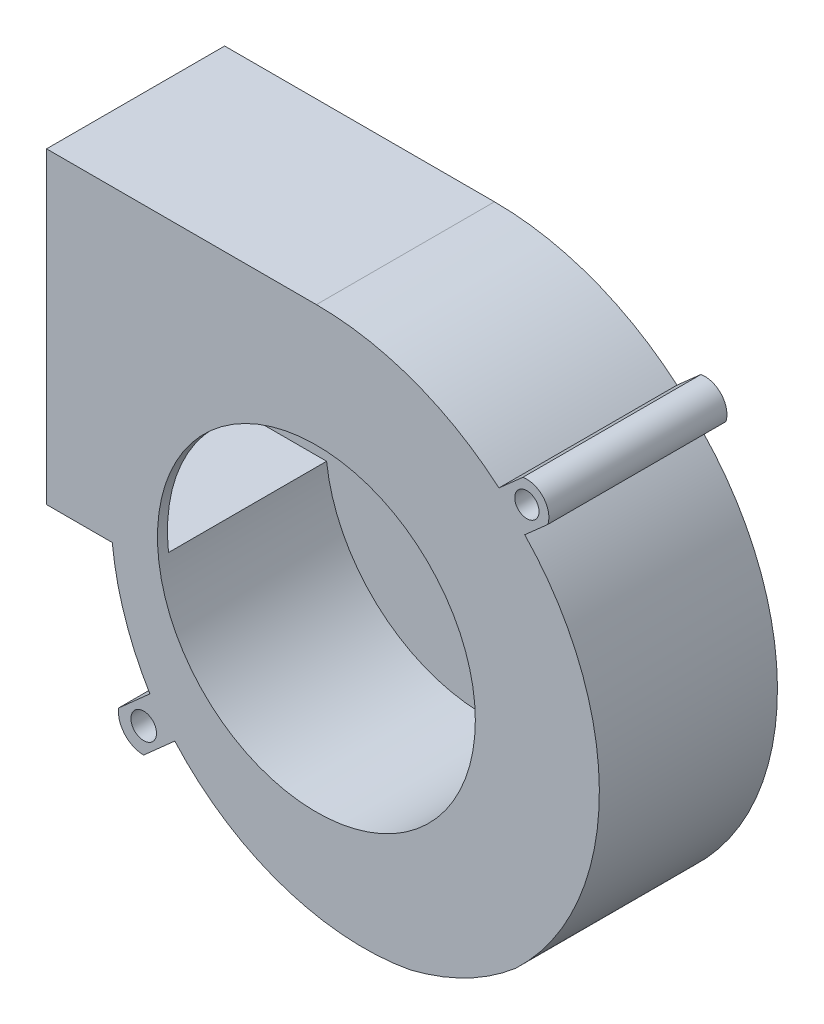
ISO-10303-21;
HEADER;
FILE_DESCRIPTION(('STEP AP214'),'2;1');
FILE_NAME('part.step','',(''),(''),'','','');
FILE_SCHEMA(('AUTOMOTIVE_DESIGN { 1 0 10303 214 1 1 1 1 }'));
ENDSEC;
DATA;
#1=APPLICATION_CONTEXT('core data for automotive mechanical design processes');
#2=APPLICATION_PROTOCOL_DEFINITION('international standard','automotive_design',2000,#1);
#3=PRODUCT_CONTEXT('',#1,'mechanical');
#4=PRODUCT('Part','Part','',(#3));
#5=PRODUCT_RELATED_PRODUCT_CATEGORY('part','',(#4));
#6=PRODUCT_DEFINITION_FORMATION('','',#4);
#7=PRODUCT_DEFINITION_CONTEXT('part definition',#1,'design');
#8=PRODUCT_DEFINITION('design','',#6,#7);
#9=PRODUCT_DEFINITION_SHAPE('','',#8);
#10=(LENGTH_UNIT() NAMED_UNIT(*) SI_UNIT(.MILLI.,.METRE.));
#11=(NAMED_UNIT(*) PLANE_ANGLE_UNIT() SI_UNIT($,.RADIAN.));
#12=(NAMED_UNIT(*) SI_UNIT($,.STERADIAN.) SOLID_ANGLE_UNIT());
#13=UNCERTAINTY_MEASURE_WITH_UNIT(LENGTH_MEASURE(1.E-05),#10,'distance_accuracy_value','');
#14=(GEOMETRIC_REPRESENTATION_CONTEXT(3) GLOBAL_UNCERTAINTY_ASSIGNED_CONTEXT((#13)) GLOBAL_UNIT_ASSIGNED_CONTEXT((#10,
#11,#12)) REPRESENTATION_CONTEXT('',''));
#15=CARTESIAN_POINT('',(0.,0.,0.));
#16=DIRECTION('',(0.,0.,1.));
#17=DIRECTION('',(1.,0.,0.));
#18=AXIS2_PLACEMENT_3D('',#15,#16,#17);
#19=CARTESIAN_POINT('',(-17.490537214231,-60.9256602946654,33.));
#20=DIRECTION('',(0.,0.,-1.));
#21=DIRECTION('',(-1.,0.,0.));
#22=AXIS2_PLACEMENT_3D('',#19,#20,#21);
#23=PLANE('',#22);
#24=CARTESIAN_POINT('',(-17.4905372142311,-60.9256602946654,33.));
#25=DIRECTION('',(0.,0.,1.));
#26=DIRECTION('',(1.,0.,0.));
#27=AXIS2_PLACEMENT_3D('',#24,#25,#26);
#28=CIRCLE('',#27,29.45);
#29=CARTESIAN_POINT('',(11.9594627857689,-60.9256602946654,33.));
#30=VERTEX_POINT('',#29);
#31=EDGE_CURVE('E225',#30,#30,#28,.T.);
#32=ORIENTED_EDGE('',*,*,#31,.F.);
#33=EDGE_LOOP('',(#32));
#34=FACE_BOUND('',#33,.T.);
#35=DIRECTION('',(-1.,0.,0.));
#36=VECTOR('',#35,1.);
#37=CARTESIAN_POINT('',(-67.490537214231,-8.92566029466538,33.));
#38=LINE('',#37,#36);
#39=CARTESIAN_POINT('',(-17.490537214231,-8.92566029466539,33.));
#40=VERTEX_POINT('',#39);
#41=CARTESIAN_POINT('',(-67.490537214231,-8.92566029466538,33.));
#42=VERTEX_POINT('',#41);
#43=EDGE_CURVE('E250',#40,#42,#38,.T.);
#44=ORIENTED_EDGE('',*,*,#43,.T.);
#45=DIRECTION('',(0.,-1.,0.));
#46=VECTOR('',#45,1.);
#47=CARTESIAN_POINT('',(-67.490537214231,-8.92566029466538,33.));
#48=LINE('',#47,#46);
#49=CARTESIAN_POINT('',(-67.490537214231,-66.0181647608201,33.));
#50=VERTEX_POINT('',#49);
#51=EDGE_CURVE('E254',#42,#50,#48,.T.);
#52=ORIENTED_EDGE('',*,*,#51,.T.);
#53=DIRECTION('',(1.,0.,0.));
#54=VECTOR('',#53,1.);
#55=CARTESIAN_POINT('',(-67.490537214231,-66.0181647608201,33.));
#56=LINE('',#55,#54);
#57=CARTESIAN_POINT('',(-55.3154359771535,-66.0181647608201,33.));
#58=VERTEX_POINT('',#57);
#59=EDGE_CURVE('E258',#50,#58,#56,.T.);
#60=ORIENTED_EDGE('',*,*,#59,.T.);
#61=CARTESIAN_POINT('',(-5.58928040063661,-60.9256602946654,33.));
#62=DIRECTION('',(0.,0.,1.));
#63=DIRECTION('',(-1.,0.,0.));
#64=AXIS2_PLACEMENT_3D('',#61,#62,#63);
#65=CIRCLE('',#64,49.9862396080939);
#66=CARTESIAN_POINT('',(-48.34494044341,-86.8211750504018,33.));
#67=VERTEX_POINT('',#66);
#68=EDGE_CURVE('E261',#58,#67,#65,.T.);
#69=ORIENTED_EDGE('',*,*,#68,.T.);
#70=DIRECTION('',(-0.747052889529198,-0.66476460513935,0.));
#71=VECTOR('',#70,1.);
#72=CARTESIAN_POINT('',(-54.153009968696,-91.9894825406946,33.));
#73=LINE('',#72,#71);
#74=CARTESIAN_POINT('',(-54.153009968696,-91.9894825406946,33.));
#75=VERTEX_POINT('',#74);
#76=EDGE_CURVE('E264',#67,#75,#73,.T.);
#77=ORIENTED_EDGE('',*,*,#76,.T.);
#78=CARTESIAN_POINT('',(-49.490537214231,-92.5256602946654,33.));
#79=DIRECTION('',(0.,0.,1.));
#80=DIRECTION('',(1.,0.,0.));
#81=AXIS2_PLACEMENT_3D('',#78,#79,#80);
#82=CIRCLE('',#81,4.69320133490787);
#83=CARTESIAN_POINT('',(-49.4996577327205,-97.218852767399,33.));
#84=VERTEX_POINT('',#83);
#85=EDGE_CURVE('E267',#75,#84,#82,.T.);
#86=ORIENTED_EDGE('',*,*,#85,.T.);
#87=DIRECTION('',(0.747052889529198,0.664764605139351,0.));
#88=VECTOR('',#87,1.);
#89=CARTESIAN_POINT('',(-49.4996577327205,-97.218852767399,33.));
#90=LINE('',#89,#88);
#91=CARTESIAN_POINT('',(-43.7324722005959,-92.0869258760589,33.));
#92=VERTEX_POINT('',#91);
#93=EDGE_CURVE('E270',#84,#92,#90,.T.);
#94=ORIENTED_EDGE('',*,*,#93,.T.);
#95=CARTESIAN_POINT('',(-8.72822714979214,-60.9256602946654,33.));
#96=DIRECTION('',(0.,0.,1.));
#97=DIRECTION('',(-1.,0.,0.));
#98=AXIS2_PLACEMENT_3D('',#95,#96,#97);
#99=CIRCLE('',#98,46.8649297898851);
#100=CARTESIAN_POINT('',(-0.10362401501067,-106.990157089685,33.));
#101=VERTEX_POINT('',#100);
#102=EDGE_CURVE('E273',#92,#101,#99,.T.);
#103=ORIENTED_EDGE('',*,*,#102,.T.);
#104=CARTESIAN_POINT('',(-11.388693724512,-60.9256602946654,33.));
#105=DIRECTION('',(0.,0.,1.));
#106=DIRECTION('',(-1.,0.,0.));
#107=AXIS2_PLACEMENT_3D('',#104,#105,#106);
#108=CIRCLE('',#107,47.4266872480746);
#109=CARTESIAN_POINT('',(19.4150708220178,-96.9869796422521,33.));
#110=VERTEX_POINT('',#109);
#111=EDGE_CURVE('E276',#101,#110,#108,.T.);
#112=ORIENTED_EDGE('',*,*,#111,.T.);
#113=CARTESIAN_POINT('',(-14.6994192154625,-60.9256602946654,33.));
#114=DIRECTION('',(0.,0.,1.));
#115=DIRECTION('',(-1.,0.,0.));
#116=AXIS2_PLACEMENT_3D('',#113,#114,#115);
#117=CIRCLE('',#116,49.6408821799731);
#118=CARTESIAN_POINT('',(21.1140825761364,-26.5511017807133,33.));
#119=VERTEX_POINT('',#118);
#120=EDGE_CURVE('E279',#110,#119,#117,.T.);
#121=ORIENTED_EDGE('',*,*,#120,.T.);
#122=DIRECTION('',(0.748618319413504,0.663001215563366,0.));
#123=VECTOR('',#122,1.);
#124=CARTESIAN_POINT('',(25.3924975337408,-22.761995577971,33.));
#125=LINE('',#124,#123);
#126=CARTESIAN_POINT('',(25.3924975337408,-22.761995577971,33.));
#127=VERTEX_POINT('',#126);
#128=EDGE_CURVE('E282',#119,#127,#125,.T.);
#129=ORIENTED_EDGE('',*,*,#128,.T.);
#130=CARTESIAN_POINT('',(21.509462785769,-21.5256602946654,33.));
#131=DIRECTION('',(0.,0.,1.));
#132=DIRECTION('',(-1.,0.,0.));
#133=AXIS2_PLACEMENT_3D('',#130,#131,#132);
#134=CIRCLE('',#133,4.07510537123927);
#135=CARTESIAN_POINT('',(20.7514890247972,-17.5216673420765,33.));
#136=VERTEX_POINT('',#135);
#137=EDGE_CURVE('E285',#127,#136,#134,.T.);
#138=ORIENTED_EDGE('',*,*,#137,.T.);
#139=DIRECTION('',(-0.748618319413503,-0.663001215563367,0.));
#140=VECTOR('',#139,1.);
#141=CARTESIAN_POINT('',(20.7514890247972,-17.5216673420765,33.));
#142=LINE('',#141,#140);
#143=CARTESIAN_POINT('',(16.3362156459673,-21.4319799022904,33.));
#144=VERTEX_POINT('',#143);
#145=EDGE_CURVE('E288',#136,#144,#142,.T.);
#146=ORIENTED_EDGE('',*,*,#145,.T.);
#147=CARTESIAN_POINT('',(-17.490537214231,-60.9256602946654,33.));
#148=DIRECTION('',(0.,0.,1.));
#149=DIRECTION('',(-1.,0.,0.));
#150=AXIS2_PLACEMENT_3D('',#147,#148,#149);
#151=CIRCLE('',#150,52.);
#152=EDGE_CURVE('E291',#144,#40,#151,.T.);
#153=ORIENTED_EDGE('',*,*,#152,.T.);
#154=EDGE_LOOP('',(#44,#52,#60,#69,#77,#86,#94,#103,#112,#121,#129,#138,#146,#153));
#155=FACE_BOUND('',#154,.T.);
#156=CARTESIAN_POINT('',(21.509462785769,-21.5256602946654,33.));
#157=DIRECTION('',(0.,0.,1.));
#158=DIRECTION('',(1.,0.,0.));
#159=AXIS2_PLACEMENT_3D('',#156,#157,#158);
#160=CIRCLE('',#159,2.25);
#161=CARTESIAN_POINT('',(23.759462785769,-21.5256602946654,33.));
#162=VERTEX_POINT('',#161);
#163=EDGE_CURVE('E242',#162,#162,#160,.T.);
#164=ORIENTED_EDGE('',*,*,#163,.F.);
#165=EDGE_LOOP('',(#164));
#166=FACE_BOUND('',#165,.T.);
#167=CARTESIAN_POINT('',(-49.490537214231,-92.5256602946654,33.));
#168=DIRECTION('',(0.,0.,1.));
#169=DIRECTION('',(1.,0.,0.));
#170=AXIS2_PLACEMENT_3D('',#167,#168,#169);
#171=CIRCLE('',#170,2.37208847710016);
#172=CARTESIAN_POINT('',(-47.1184487371309,-92.5256602946654,33.));
#173=VERTEX_POINT('',#172);
#174=EDGE_CURVE('E234',#173,#173,#171,.T.);
#175=ORIENTED_EDGE('',*,*,#174,.F.);
#176=EDGE_LOOP('',(#175));
#177=FACE_BOUND('',#176,.T.);
#178=ADVANCED_FACE('F43',(#34,#155,#166,#177),#23,.F.);
#179=CARTESIAN_POINT('',(-17.490537214231,-60.9256602946654,0.));
#180=DIRECTION('',(0.,0.,-1.));
#181=DIRECTION('',(-1.,0.,0.));
#182=AXIS2_PLACEMENT_3D('',#179,#180,#181);
#183=PLANE('',#182);
#184=CARTESIAN_POINT('',(21.509462785769,-21.5256602946654,0.));
#185=DIRECTION('',(0.,0.,1.));
#186=DIRECTION('',(1.,0.,0.));
#187=AXIS2_PLACEMENT_3D('',#184,#185,#186);
#188=CIRCLE('',#187,2.25);
#189=CARTESIAN_POINT('',(23.759462785769,-21.5256602946654,0.));
#190=VERTEX_POINT('',#189);
#191=EDGE_CURVE('E238',#190,#190,#188,.T.);
#192=ORIENTED_EDGE('',*,*,#191,.T.);
#193=EDGE_LOOP('',(#192));
#194=FACE_BOUND('',#193,.T.);
#195=DIRECTION('',(-1.,0.,0.));
#196=VECTOR('',#195,1.);
#197=CARTESIAN_POINT('',(-67.490537214231,-8.92566029466538,0.));
#198=LINE('',#197,#196);
#199=CARTESIAN_POINT('',(-17.490537214231,-8.92566029466539,0.));
#200=VERTEX_POINT('',#199);
#201=CARTESIAN_POINT('',(-67.490537214231,-8.92566029466538,0.));
#202=VERTEX_POINT('',#201);
#203=EDGE_CURVE('E246',#200,#202,#198,.T.);
#204=ORIENTED_EDGE('',*,*,#203,.F.);
#205=CARTESIAN_POINT('',(-17.490537214231,-60.9256602946654,0.));
#206=DIRECTION('',(0.,0.,1.));
#207=DIRECTION('',(-1.,0.,0.));
#208=AXIS2_PLACEMENT_3D('',#205,#206,#207);
#209=CIRCLE('',#208,52.);
#210=CARTESIAN_POINT('',(16.3362156459673,-21.4319799022904,0.));
#211=VERTEX_POINT('',#210);
#212=EDGE_CURVE('E255',#211,#200,#209,.T.);
#213=ORIENTED_EDGE('',*,*,#212,.F.);
#214=DIRECTION('',(-0.748618319413503,-0.663001215563367,0.));
#215=VECTOR('',#214,1.);
#216=CARTESIAN_POINT('',(20.7514890247972,-17.5216673420765,0.));
#217=LINE('',#216,#215);
#218=CARTESIAN_POINT('',(20.7514890247972,-17.5216673420765,0.));
#219=VERTEX_POINT('',#218);
#220=EDGE_CURVE('E331',#219,#211,#217,.T.);
#221=ORIENTED_EDGE('',*,*,#220,.F.);
#222=CARTESIAN_POINT('',(21.509462785769,-21.5256602946654,0.));
#223=DIRECTION('',(0.,0.,1.));
#224=DIRECTION('',(-1.,0.,0.));
#225=AXIS2_PLACEMENT_3D('',#222,#223,#224);
#226=CIRCLE('',#225,4.07510537123927);
#227=CARTESIAN_POINT('',(25.3924975337408,-22.761995577971,0.));
#228=VERTEX_POINT('',#227);
#229=EDGE_CURVE('E328',#228,#219,#226,.T.);
#230=ORIENTED_EDGE('',*,*,#229,.F.);
#231=DIRECTION('',(0.748618319413504,0.663001215563366,0.));
#232=VECTOR('',#231,1.);
#233=CARTESIAN_POINT('',(25.3924975337408,-22.761995577971,0.));
#234=LINE('',#233,#232);
#235=CARTESIAN_POINT('',(21.1140825761364,-26.5511017807133,0.));
#236=VERTEX_POINT('',#235);
#237=EDGE_CURVE('E325',#236,#228,#234,.T.);
#238=ORIENTED_EDGE('',*,*,#237,.F.);
#239=CARTESIAN_POINT('',(-14.6994192154625,-60.9256602946654,0.));
#240=DIRECTION('',(0.,0.,1.));
#241=DIRECTION('',(-1.,0.,0.));
#242=AXIS2_PLACEMENT_3D('',#239,#240,#241);
#243=CIRCLE('',#242,49.6408821799731);
#244=CARTESIAN_POINT('',(19.4150708220178,-96.9869796422521,0.));
#245=VERTEX_POINT('',#244);
#246=EDGE_CURVE('E322',#245,#236,#243,.T.);
#247=ORIENTED_EDGE('',*,*,#246,.F.);
#248=CARTESIAN_POINT('',(-11.388693724512,-60.9256602946654,0.));
#249=DIRECTION('',(0.,0.,1.));
#250=DIRECTION('',(-1.,0.,0.));
#251=AXIS2_PLACEMENT_3D('',#248,#249,#250);
#252=CIRCLE('',#251,47.4266872480746);
#253=CARTESIAN_POINT('',(-0.10362401501067,-106.990157089685,0.));
#254=VERTEX_POINT('',#253);
#255=EDGE_CURVE('E319',#254,#245,#252,.T.);
#256=ORIENTED_EDGE('',*,*,#255,.F.);
#257=CARTESIAN_POINT('',(-8.72822714979214,-60.9256602946654,0.));
#258=DIRECTION('',(0.,0.,1.));
#259=DIRECTION('',(-1.,0.,0.));
#260=AXIS2_PLACEMENT_3D('',#257,#258,#259);
#261=CIRCLE('',#260,46.8649297898851);
#262=CARTESIAN_POINT('',(-43.7324722005959,-92.0869258760589,0.));
#263=VERTEX_POINT('',#262);
#264=EDGE_CURVE('E316',#263,#254,#261,.T.);
#265=ORIENTED_EDGE('',*,*,#264,.F.);
#266=DIRECTION('',(0.747052889529198,0.664764605139351,0.));
#267=VECTOR('',#266,1.);
#268=CARTESIAN_POINT('',(-49.4996577327205,-97.218852767399,0.));
#269=LINE('',#268,#267);
#270=CARTESIAN_POINT('',(-49.4996577327205,-97.218852767399,0.));
#271=VERTEX_POINT('',#270);
#272=EDGE_CURVE('E313',#271,#263,#269,.T.);
#273=ORIENTED_EDGE('',*,*,#272,.F.);
#274=CARTESIAN_POINT('',(-49.490537214231,-92.5256602946654,0.));
#275=DIRECTION('',(0.,0.,1.));
#276=DIRECTION('',(1.,0.,0.));
#277=AXIS2_PLACEMENT_3D('',#274,#275,#276);
#278=CIRCLE('',#277,4.69320133490787);
#279=CARTESIAN_POINT('',(-54.153009968696,-91.9894825406946,0.));
#280=VERTEX_POINT('',#279);
#281=EDGE_CURVE('E310',#280,#271,#278,.T.);
#282=ORIENTED_EDGE('',*,*,#281,.F.);
#283=DIRECTION('',(-0.747052889529198,-0.66476460513935,0.));
#284=VECTOR('',#283,1.);
#285=CARTESIAN_POINT('',(-54.153009968696,-91.9894825406946,0.));
#286=LINE('',#285,#284);
#287=CARTESIAN_POINT('',(-48.34494044341,-86.8211750504018,0.));
#288=VERTEX_POINT('',#287);
#289=EDGE_CURVE('E307',#288,#280,#286,.T.);
#290=ORIENTED_EDGE('',*,*,#289,.F.);
#291=CARTESIAN_POINT('',(-5.58928040063661,-60.9256602946654,0.));
#292=DIRECTION('',(0.,0.,1.));
#293=DIRECTION('',(-1.,0.,0.));
#294=AXIS2_PLACEMENT_3D('',#291,#292,#293);
#295=CIRCLE('',#294,49.9862396080939);
#296=CARTESIAN_POINT('',(-55.3154359771535,-66.0181647608201,0.));
#297=VERTEX_POINT('',#296);
#298=EDGE_CURVE('E304',#297,#288,#295,.T.);
#299=ORIENTED_EDGE('',*,*,#298,.F.);
#300=DIRECTION('',(1.,0.,0.));
#301=VECTOR('',#300,1.);
#302=CARTESIAN_POINT('',(-67.490537214231,-66.0181647608201,0.));
#303=LINE('',#302,#301);
#304=CARTESIAN_POINT('',(-67.490537214231,-66.0181647608201,0.));
#305=VERTEX_POINT('',#304);
#306=EDGE_CURVE('E301',#305,#297,#303,.T.);
#307=ORIENTED_EDGE('',*,*,#306,.F.);
#308=DIRECTION('',(0.,-1.,0.));
#309=VECTOR('',#308,1.);
#310=CARTESIAN_POINT('',(-67.490537214231,-8.92566029466538,0.));
#311=LINE('',#310,#309);
#312=EDGE_CURVE('E298',#202,#305,#311,.T.);
#313=ORIENTED_EDGE('',*,*,#312,.F.);
#314=EDGE_LOOP('',(#204,#213,#221,#230,#238,#247,#256,#265,#273,#282,#290,#299,#307,#313));
#315=FACE_BOUND('',#314,.T.);
#316=CARTESIAN_POINT('',(-49.490537214231,-92.5256602946654,0.));
#317=DIRECTION('',(0.,0.,1.));
#318=DIRECTION('',(1.,0.,0.));
#319=AXIS2_PLACEMENT_3D('',#316,#317,#318);
#320=CIRCLE('',#319,2.37208847710016);
#321=CARTESIAN_POINT('',(-47.1184487371309,-92.5256602946654,0.));
#322=VERTEX_POINT('',#321);
#323=EDGE_CURVE('E230',#322,#322,#320,.T.);
#324=ORIENTED_EDGE('',*,*,#323,.T.);
#325=EDGE_LOOP('',(#324));
#326=FACE_BOUND('',#325,.T.);
#327=ADVANCED_FACE('F398',(#194,#315,#326),#183,.T.);
#328=CARTESIAN_POINT('',(-67.490537214231,-8.92566029466538,33.));
#329=DIRECTION('',(0.,-1.,0.));
#330=DIRECTION('',(0.,0.,-1.));
#331=AXIS2_PLACEMENT_3D('',#328,#329,#330);
#332=PLANE('',#331);
#333=ORIENTED_EDGE('',*,*,#203,.T.);
#334=DIRECTION('',(0.,0.,-1.));
#335=VECTOR('',#334,1.);
#336=CARTESIAN_POINT('',(-67.490537214231,-8.92566029466538,33.));
#337=LINE('',#336,#335);
#338=EDGE_CURVE('E52',#42,#202,#337,.T.);
#339=ORIENTED_EDGE('',*,*,#338,.F.);
#340=ORIENTED_EDGE('',*,*,#43,.F.);
#341=DIRECTION('',(0.,0.,-1.));
#342=VECTOR('',#341,1.);
#343=CARTESIAN_POINT('',(-17.490537214231,-8.92566029466539,33.));
#344=LINE('',#343,#342);
#345=EDGE_CURVE('E294',#40,#200,#344,.T.);
#346=ORIENTED_EDGE('',*,*,#345,.T.);
#347=EDGE_LOOP('',(#333,#339,#340,#346));
#348=FACE_BOUND('',#347,.T.);
#349=ADVANCED_FACE('F45',(#348),#332,.F.);
#350=CARTESIAN_POINT('',(-67.490537214231,-8.92566029466538,33.));
#351=DIRECTION('',(1.,0.,0.));
#352=DIRECTION('',(0.,0.,-1.));
#353=AXIS2_PLACEMENT_3D('',#350,#351,#352);
#354=PLANE('',#353);
#355=DIRECTION('',(0.,0.,1.));
#356=VECTOR('',#355,1.);
#357=CARTESIAN_POINT('',(-67.490537214231,-64.2681647608201,31.15));
#358=LINE('',#357,#356);
#359=CARTESIAN_POINT('',(-67.490537214231,-64.2681647608201,1.85));
#360=VERTEX_POINT('',#359);
#361=CARTESIAN_POINT('',(-67.490537214231,-64.2681647608201,31.15));
#362=VERTEX_POINT('',#361);
#363=EDGE_CURVE('E206',#360,#362,#358,.T.);
#364=ORIENTED_EDGE('',*,*,#363,.F.);
#365=DIRECTION('',(0.,-1.,0.));
#366=VECTOR('',#365,1.);
#367=CARTESIAN_POINT('',(-67.490537214231,-64.2681647608201,1.85));
#368=LINE('',#367,#366);
#369=CARTESIAN_POINT('',(-67.490537214231,-10.7756602946654,1.85));
#370=VERTEX_POINT('',#369);
#371=EDGE_CURVE('E59',#370,#360,#368,.T.);
#372=ORIENTED_EDGE('',*,*,#371,.F.);
#373=DIRECTION('',(0.,0.,-1.));
#374=VECTOR('',#373,1.);
#375=CARTESIAN_POINT('',(-67.490537214231,-10.7756602946654,1.85));
#376=LINE('',#375,#374);
#377=CARTESIAN_POINT('',(-67.490537214231,-10.7756602946654,31.15));
#378=VERTEX_POINT('',#377);
#379=EDGE_CURVE('E212',#378,#370,#376,.T.);
#380=ORIENTED_EDGE('',*,*,#379,.F.);
#381=DIRECTION('',(0.,1.,0.));
#382=VECTOR('',#381,1.);
#383=CARTESIAN_POINT('',(-67.490537214231,-10.7756602946654,31.15));
#384=LINE('',#383,#382);
#385=EDGE_CURVE('E188',#362,#378,#384,.T.);
#386=ORIENTED_EDGE('',*,*,#385,.F.);
#387=EDGE_LOOP('',(#364,#372,#380,#386));
#388=FACE_BOUND('',#387,.T.);
#389=ORIENTED_EDGE('',*,*,#312,.T.);
#390=DIRECTION('',(0.,0.,-1.));
#391=VECTOR('',#390,1.);
#392=CARTESIAN_POINT('',(-67.490537214231,-66.0181647608201,33.));
#393=LINE('',#392,#391);
#394=EDGE_CURVE('E383',#50,#305,#393,.T.);
#395=ORIENTED_EDGE('',*,*,#394,.F.);
#396=ORIENTED_EDGE('',*,*,#51,.F.);
#397=ORIENTED_EDGE('',*,*,#338,.T.);
#398=EDGE_LOOP('',(#389,#395,#396,#397));
#399=FACE_BOUND('',#398,.T.);
#400=ADVANCED_FACE('F390',(#388,#399),#354,.F.);
#401=CARTESIAN_POINT('',(-67.490537214231,-66.0181647608201,33.));
#402=DIRECTION('',(0.,1.,0.));
#403=DIRECTION('',(0.,0.,1.));
#404=AXIS2_PLACEMENT_3D('',#401,#402,#403);
#405=PLANE('',#404);
#406=ORIENTED_EDGE('',*,*,#306,.T.);
#407=DIRECTION('',(0.,0.,-1.));
#408=VECTOR('',#407,1.);
#409=CARTESIAN_POINT('',(-55.3154359771535,-66.0181647608201,33.));
#410=LINE('',#409,#408);
#411=EDGE_CURVE('E379',#58,#297,#410,.T.);
#412=ORIENTED_EDGE('',*,*,#411,.F.);
#413=ORIENTED_EDGE('',*,*,#59,.F.);
#414=ORIENTED_EDGE('',*,*,#394,.T.);
#415=EDGE_LOOP('',(#406,#412,#413,#414));
#416=FACE_BOUND('',#415,.T.);
#417=ADVANCED_FACE('F406',(#416),#405,.F.);
#418=CARTESIAN_POINT('',(-5.58928040063661,-60.9256602946654,33.));
#419=DIRECTION('',(0.,0.,-1.));
#420=DIRECTION('',(-1.,0.,0.));
#421=AXIS2_PLACEMENT_3D('',#418,#419,#420);
#422=CYLINDRICAL_SURFACE('',#421,49.9862396080939);
#423=ORIENTED_EDGE('',*,*,#298,.T.);
#424=DIRECTION('',(0.,0.,-1.));
#425=VECTOR('',#424,1.);
#426=CARTESIAN_POINT('',(-48.34494044341,-86.8211750504018,33.));
#427=LINE('',#426,#425);
#428=EDGE_CURVE('E375',#67,#288,#427,.T.);
#429=ORIENTED_EDGE('',*,*,#428,.F.);
#430=ORIENTED_EDGE('',*,*,#68,.F.);
#431=ORIENTED_EDGE('',*,*,#411,.T.);
#432=EDGE_LOOP('',(#423,#429,#430,#431));
#433=FACE_BOUND('',#432,.T.);
#434=ADVANCED_FACE('F410',(#433),#422,.T.);
#435=CARTESIAN_POINT('',(-54.153009968696,-91.9894825406946,33.));
#436=DIRECTION('',(0.66476460513935,-0.747052889529198,0.));
#437=DIRECTION('',(0.747052889529198,0.66476460513935,0.));
#438=AXIS2_PLACEMENT_3D('',#435,#436,#437);
#439=PLANE('',#438);
#440=ORIENTED_EDGE('',*,*,#289,.T.);
#441=DIRECTION('',(0.,0.,-1.));
#442=VECTOR('',#441,1.);
#443=CARTESIAN_POINT('',(-54.153009968696,-91.9894825406946,33.));
#444=LINE('',#443,#442);
#445=EDGE_CURVE('E371',#75,#280,#444,.T.);
#446=ORIENTED_EDGE('',*,*,#445,.F.);
#447=ORIENTED_EDGE('',*,*,#76,.F.);
#448=ORIENTED_EDGE('',*,*,#428,.T.);
#449=EDGE_LOOP('',(#440,#446,#447,#448));
#450=FACE_BOUND('',#449,.T.);
#451=ADVANCED_FACE('F459',(#450),#439,.F.);
#452=CARTESIAN_POINT('',(-49.490537214231,-92.5256602946654,33.));
#453=DIRECTION('',(0.,0.,-1.));
#454=DIRECTION('',(-1.,0.,0.));
#455=AXIS2_PLACEMENT_3D('',#452,#453,#454);
#456=CYLINDRICAL_SURFACE('',#455,4.69320133490787);
#457=ORIENTED_EDGE('',*,*,#281,.T.);
#458=DIRECTION('',(0.,0.,-1.));
#459=VECTOR('',#458,1.);
#460=CARTESIAN_POINT('',(-49.4996577327205,-97.218852767399,33.));
#461=LINE('',#460,#459);
#462=EDGE_CURVE('E367',#84,#271,#461,.T.);
#463=ORIENTED_EDGE('',*,*,#462,.F.);
#464=ORIENTED_EDGE('',*,*,#85,.F.);
#465=ORIENTED_EDGE('',*,*,#445,.T.);
#466=EDGE_LOOP('',(#457,#463,#464,#465));
#467=FACE_BOUND('',#466,.T.);
#468=ADVANCED_FACE('F456',(#467),#456,.T.);
#469=CARTESIAN_POINT('',(-49.4996577327205,-97.218852767399,33.));
#470=DIRECTION('',(-0.66476460513935,0.747052889529197,0.));
#471=DIRECTION('',(-0.747052889529197,-0.664764605139351,0.));
#472=AXIS2_PLACEMENT_3D('',#469,#470,#471);
#473=PLANE('',#472);
#474=ORIENTED_EDGE('',*,*,#272,.T.);
#475=DIRECTION('',(0.,0.,-1.));
#476=VECTOR('',#475,1.);
#477=CARTESIAN_POINT('',(-43.7324722005959,-92.0869258760589,33.));
#478=LINE('',#477,#476);
#479=EDGE_CURVE('E363',#92,#263,#478,.T.);
#480=ORIENTED_EDGE('',*,*,#479,.F.);
#481=ORIENTED_EDGE('',*,*,#93,.F.);
#482=ORIENTED_EDGE('',*,*,#462,.T.);
#483=EDGE_LOOP('',(#474,#480,#481,#482));
#484=FACE_BOUND('',#483,.T.);
#485=ADVANCED_FACE('F452',(#484),#473,.F.);
#486=CARTESIAN_POINT('',(-8.72822714979214,-60.9256602946654,33.));
#487=DIRECTION('',(0.,0.,-1.));
#488=DIRECTION('',(-1.,0.,0.));
#489=AXIS2_PLACEMENT_3D('',#486,#487,#488);
#490=CYLINDRICAL_SURFACE('',#489,46.8649297898851);
#491=ORIENTED_EDGE('',*,*,#264,.T.);
#492=DIRECTION('',(0.,0.,-1.));
#493=VECTOR('',#492,1.);
#494=CARTESIAN_POINT('',(-0.10362401501067,-106.990157089685,33.));
#495=LINE('',#494,#493);
#496=EDGE_CURVE('E359',#101,#254,#495,.T.);
#497=ORIENTED_EDGE('',*,*,#496,.F.);
#498=ORIENTED_EDGE('',*,*,#102,.F.);
#499=ORIENTED_EDGE('',*,*,#479,.T.);
#500=EDGE_LOOP('',(#491,#497,#498,#499));
#501=FACE_BOUND('',#500,.T.);
#502=ADVANCED_FACE('F448',(#501),#490,.T.);
#503=CARTESIAN_POINT('',(-11.388693724512,-60.9256602946654,33.));
#504=DIRECTION('',(0.,0.,-1.));
#505=DIRECTION('',(-1.,0.,0.));
#506=AXIS2_PLACEMENT_3D('',#503,#504,#505);
#507=CYLINDRICAL_SURFACE('',#506,47.4266872480746);
#508=ORIENTED_EDGE('',*,*,#255,.T.);
#509=DIRECTION('',(0.,0.,-1.));
#510=VECTOR('',#509,1.);
#511=CARTESIAN_POINT('',(19.4150708220178,-96.9869796422521,33.));
#512=LINE('',#511,#510);
#513=EDGE_CURVE('E355',#110,#245,#512,.T.);
#514=ORIENTED_EDGE('',*,*,#513,.F.);
#515=ORIENTED_EDGE('',*,*,#111,.F.);
#516=ORIENTED_EDGE('',*,*,#496,.T.);
#517=EDGE_LOOP('',(#508,#514,#515,#516));
#518=FACE_BOUND('',#517,.T.);
#519=ADVANCED_FACE('F443',(#518),#507,.T.);
#520=CARTESIAN_POINT('',(-14.6994192154625,-60.9256602946654,33.));
#521=DIRECTION('',(0.,0.,-1.));
#522=DIRECTION('',(-1.,0.,0.));
#523=AXIS2_PLACEMENT_3D('',#520,#521,#522);
#524=CYLINDRICAL_SURFACE('',#523,49.6408821799731);
#525=ORIENTED_EDGE('',*,*,#246,.T.);
#526=DIRECTION('',(0.,0.,-1.));
#527=VECTOR('',#526,1.);
#528=CARTESIAN_POINT('',(21.1140825761364,-26.5511017807133,33.));
#529=LINE('',#528,#527);
#530=EDGE_CURVE('E351',#119,#236,#529,.T.);
#531=ORIENTED_EDGE('',*,*,#530,.F.);
#532=ORIENTED_EDGE('',*,*,#120,.F.);
#533=ORIENTED_EDGE('',*,*,#513,.T.);
#534=EDGE_LOOP('',(#525,#531,#532,#533));
#535=FACE_BOUND('',#534,.T.);
#536=ADVANCED_FACE('F437',(#535),#524,.T.);
#537=CARTESIAN_POINT('',(25.3924975337408,-22.761995577971,33.));
#538=DIRECTION('',(-0.663001215563366,0.748618319413504,0.));
#539=DIRECTION('',(-0.748618319413504,-0.663001215563366,0.));
#540=AXIS2_PLACEMENT_3D('',#537,#538,#539);
#541=PLANE('',#540);
#542=ORIENTED_EDGE('',*,*,#237,.T.);
#543=DIRECTION('',(0.,0.,-1.));
#544=VECTOR('',#543,1.);
#545=CARTESIAN_POINT('',(25.3924975337408,-22.761995577971,33.));
#546=LINE('',#545,#544);
#547=EDGE_CURVE('E347',#127,#228,#546,.T.);
#548=ORIENTED_EDGE('',*,*,#547,.F.);
#549=ORIENTED_EDGE('',*,*,#128,.F.);
#550=ORIENTED_EDGE('',*,*,#530,.T.);
#551=EDGE_LOOP('',(#542,#548,#549,#550));
#552=FACE_BOUND('',#551,.T.);
#553=ADVANCED_FACE('F433',(#552),#541,.F.);
#554=CARTESIAN_POINT('',(21.509462785769,-21.5256602946654,33.));
#555=DIRECTION('',(0.,0.,-1.));
#556=DIRECTION('',(-1.,0.,0.));
#557=AXIS2_PLACEMENT_3D('',#554,#555,#556);
#558=CYLINDRICAL_SURFACE('',#557,4.07510537123927);
#559=ORIENTED_EDGE('',*,*,#229,.T.);
#560=DIRECTION('',(0.,0.,-1.));
#561=VECTOR('',#560,1.);
#562=CARTESIAN_POINT('',(20.7514890247972,-17.5216673420765,33.));
#563=LINE('',#562,#561);
#564=EDGE_CURVE('E343',#136,#219,#563,.T.);
#565=ORIENTED_EDGE('',*,*,#564,.F.);
#566=ORIENTED_EDGE('',*,*,#137,.F.);
#567=ORIENTED_EDGE('',*,*,#547,.T.);
#568=EDGE_LOOP('',(#559,#565,#566,#567));
#569=FACE_BOUND('',#568,.T.);
#570=ADVANCED_FACE('F428',(#569),#558,.T.);
#571=CARTESIAN_POINT('',(20.7514890247972,-17.5216673420765,33.));
#572=DIRECTION('',(0.663001215563367,-0.748618319413503,0.));
#573=DIRECTION('',(0.748618319413503,0.663001215563367,0.));
#574=AXIS2_PLACEMENT_3D('',#571,#572,#573);
#575=PLANE('',#574);
#576=ORIENTED_EDGE('',*,*,#220,.T.);
#577=DIRECTION('',(0.,0.,-1.));
#578=VECTOR('',#577,1.);
#579=CARTESIAN_POINT('',(16.3362156459673,-21.4319799022904,33.));
#580=LINE('',#579,#578);
#581=EDGE_CURVE('E339',#144,#211,#580,.T.);
#582=ORIENTED_EDGE('',*,*,#581,.F.);
#583=ORIENTED_EDGE('',*,*,#145,.F.);
#584=ORIENTED_EDGE('',*,*,#564,.T.);
#585=EDGE_LOOP('',(#576,#582,#583,#584));
#586=FACE_BOUND('',#585,.T.);
#587=ADVANCED_FACE('F422',(#586),#575,.F.);
#588=CARTESIAN_POINT('',(-17.490537214231,-60.9256602946654,33.));
#589=DIRECTION('',(0.,0.,-1.));
#590=DIRECTION('',(-1.,0.,0.));
#591=AXIS2_PLACEMENT_3D('',#588,#589,#590);
#592=CYLINDRICAL_SURFACE('',#591,52.);
#593=ORIENTED_EDGE('',*,*,#212,.T.);
#594=ORIENTED_EDGE('',*,*,#345,.F.);
#595=ORIENTED_EDGE('',*,*,#152,.F.);
#596=ORIENTED_EDGE('',*,*,#581,.T.);
#597=EDGE_LOOP('',(#593,#594,#595,#596));
#598=FACE_BOUND('',#597,.T.);
#599=ADVANCED_FACE('F420',(#598),#592,.T.);
#600=CARTESIAN_POINT('',(21.509462785769,-21.5256602946654,33.));
#601=DIRECTION('',(0.,0.,-1.));
#602=DIRECTION('',(-1.,0.,0.));
#603=AXIS2_PLACEMENT_3D('',#600,#601,#602);
#604=CYLINDRICAL_SURFACE('',#603,2.25);
#605=ORIENTED_EDGE('',*,*,#163,.T.);
#606=EDGE_LOOP('',(#605));
#607=FACE_BOUND('',#606,.T.);
#608=ORIENTED_EDGE('',*,*,#191,.F.);
#609=EDGE_LOOP('',(#608));
#610=FACE_BOUND('',#609,.T.);
#611=ADVANCED_FACE('F478',(#607,#610),#604,.F.);
#612=CARTESIAN_POINT('',(-49.490537214231,-92.5256602946654,33.));
#613=DIRECTION('',(0.,0.,-1.));
#614=DIRECTION('',(-1.,0.,0.));
#615=AXIS2_PLACEMENT_3D('',#612,#613,#614);
#616=CYLINDRICAL_SURFACE('',#615,2.37208847710016);
#617=ORIENTED_EDGE('',*,*,#174,.T.);
#618=EDGE_LOOP('',(#617));
#619=FACE_BOUND('',#618,.T.);
#620=ORIENTED_EDGE('',*,*,#323,.F.);
#621=EDGE_LOOP('',(#620));
#622=FACE_BOUND('',#621,.T.);
#623=ADVANCED_FACE('F534',(#619,#622),#616,.F.);
#624=CARTESIAN_POINT('',(-17.4905372142311,-60.9256602946654,1.85));
#625=DIRECTION('',(0.,0.,1.));
#626=DIRECTION('',(1.,0.,0.));
#627=AXIS2_PLACEMENT_3D('',#624,#625,#626);
#628=CYLINDRICAL_SURFACE('',#627,29.45);
#629=CARTESIAN_POINT('',(-17.4905372142311,-60.9256602946654,1.85));
#630=DIRECTION('',(0.,0.,1.));
#631=DIRECTION('',(1.,0.,0.));
#632=AXIS2_PLACEMENT_3D('',#629,#630,#631);
#633=CIRCLE('',#632,29.45);
#634=CARTESIAN_POINT('',(-46.7502392614792,-64.2681647608201,1.85));
#635=VERTEX_POINT('',#634);
#636=CARTESIAN_POINT('',(-9.49053721423104,-32.583068670045,1.85));
#637=VERTEX_POINT('',#636);
#638=EDGE_CURVE('E226',#635,#637,#633,.T.);
#639=ORIENTED_EDGE('',*,*,#638,.F.);
#640=DIRECTION('',(0.,0.,1.));
#641=VECTOR('',#640,1.);
#642=CARTESIAN_POINT('',(-46.7502392614792,-64.2681647608201,1.85));
#643=LINE('',#642,#641);
#644=CARTESIAN_POINT('',(-46.7502392614792,-64.2681647608201,31.15));
#645=VERTEX_POINT('',#644);
#646=EDGE_CURVE('E221',#635,#645,#643,.T.);
#647=ORIENTED_EDGE('',*,*,#646,.T.);
#648=CARTESIAN_POINT('',(-17.4905372142311,-60.9256602946654,31.15));
#649=DIRECTION('',(0.,0.,1.));
#650=DIRECTION('',(0.,-1.,0.));
#651=AXIS2_PLACEMENT_3D('',#648,#649,#650);
#652=CIRCLE('',#651,29.45);
#653=CARTESIAN_POINT('',(-9.49053721423104,-32.583068670045,31.15));
#654=VERTEX_POINT('',#653);
#655=EDGE_CURVE('E11',#645,#654,#652,.F.);
#656=ORIENTED_EDGE('',*,*,#655,.T.);
#657=DIRECTION('',(0.,0.,1.));
#658=VECTOR('',#657,1.);
#659=CARTESIAN_POINT('',(-9.49053721423104,-32.583068670045,1.85));
#660=LINE('',#659,#658);
#661=EDGE_CURVE('E180',#654,#637,#660,.F.);
#662=ORIENTED_EDGE('',*,*,#661,.T.);
#663=EDGE_LOOP('',(#639,#647,#656,#662));
#664=FACE_BOUND('',#663,.T.);
#665=ORIENTED_EDGE('',*,*,#31,.T.);
#666=EDGE_LOOP('',(#665));
#667=FACE_BOUND('',#666,.T.);
#668=ADVANCED_FACE('F541',(#664,#667),#628,.F.);
#669=CARTESIAN_POINT('',(-17.4905372142311,-60.9256602946654,1.85));
#670=DIRECTION('',(0.,0.,1.));
#671=DIRECTION('',(1.,0.,0.));
#672=AXIS2_PLACEMENT_3D('',#669,#670,#671);
#673=PLANE('',#672);
#674=ORIENTED_EDGE('',*,*,#638,.T.);
#675=DIRECTION('',(0.,-1.,0.));
#676=VECTOR('',#675,1.);
#677=CARTESIAN_POINT('',(-9.49053721423104,-64.2681647608201,1.85));
#678=LINE('',#677,#676);
#679=CARTESIAN_POINT('',(-9.49053721423104,-10.7756602946654,1.85));
#680=VERTEX_POINT('',#679);
#681=EDGE_CURVE('E67',#680,#637,#678,.T.);
#682=ORIENTED_EDGE('',*,*,#681,.F.);
#683=DIRECTION('',(-1.,0.,0.));
#684=VECTOR('',#683,1.);
#685=CARTESIAN_POINT('',(-9.49053721423104,-10.7756602946654,1.85));
#686=LINE('',#685,#684);
#687=EDGE_CURVE('E193',#680,#370,#686,.T.);
#688=ORIENTED_EDGE('',*,*,#687,.T.);
#689=ORIENTED_EDGE('',*,*,#371,.T.);
#690=DIRECTION('',(-1.,0.,0.));
#691=VECTOR('',#690,1.);
#692=CARTESIAN_POINT('',(-9.49053721423104,-64.2681647608201,1.85));
#693=LINE('',#692,#691);
#694=EDGE_CURVE('E198',#635,#360,#693,.T.);
#695=ORIENTED_EDGE('',*,*,#694,.F.);
#696=EDGE_LOOP('',(#674,#682,#688,#689,#695));
#697=FACE_BOUND('',#696,.T.);
#698=ADVANCED_FACE('F548',(#697),#673,.T.);
#699=CARTESIAN_POINT('',(-9.49053721423104,-10.7756602946654,31.15));
#700=DIRECTION('',(0.,0.,1.));
#701=DIRECTION('',(0.,-1.,0.));
#702=AXIS2_PLACEMENT_3D('',#699,#700,#701);
#703=PLANE('',#702);
#704=DIRECTION('',(-1.,0.,0.));
#705=VECTOR('',#704,1.);
#706=CARTESIAN_POINT('',(-9.49053721423104,-64.2681647608201,31.15));
#707=LINE('',#706,#705);
#708=EDGE_CURVE('E194',#645,#362,#707,.T.);
#709=ORIENTED_EDGE('',*,*,#708,.T.);
#710=ORIENTED_EDGE('',*,*,#385,.T.);
#711=DIRECTION('',(-1.,0.,0.));
#712=VECTOR('',#711,1.);
#713=CARTESIAN_POINT('',(-9.49053721423104,-10.7756602946654,31.15));
#714=LINE('',#713,#712);
#715=CARTESIAN_POINT('',(-9.49053721423104,-10.7756602946654,31.15));
#716=VERTEX_POINT('',#715);
#717=EDGE_CURVE('E185',#716,#378,#714,.T.);
#718=ORIENTED_EDGE('',*,*,#717,.F.);
#719=DIRECTION('',(0.,1.,0.));
#720=VECTOR('',#719,1.);
#721=CARTESIAN_POINT('',(-9.49053721423104,-10.7756602946654,31.15));
#722=LINE('',#721,#720);
#723=EDGE_CURVE('E175',#654,#716,#722,.T.);
#724=ORIENTED_EDGE('',*,*,#723,.F.);
#725=ORIENTED_EDGE('',*,*,#655,.F.);
#726=EDGE_LOOP('',(#709,#710,#718,#724,#725));
#727=FACE_BOUND('',#726,.T.);
#728=ADVANCED_FACE('F186',(#727),#703,.F.);
#729=CARTESIAN_POINT('',(-9.49053721423104,-64.2681647608201,31.15));
#730=DIRECTION('',(0.,-1.,0.));
#731=DIRECTION('',(0.,0.,-1.));
#732=AXIS2_PLACEMENT_3D('',#729,#730,#731);
#733=PLANE('',#732);
#734=ORIENTED_EDGE('',*,*,#694,.T.);
#735=ORIENTED_EDGE('',*,*,#363,.T.);
#736=ORIENTED_EDGE('',*,*,#708,.F.);
#737=ORIENTED_EDGE('',*,*,#646,.F.);
#738=EDGE_LOOP('',(#734,#735,#736,#737));
#739=FACE_BOUND('',#738,.T.);
#740=ADVANCED_FACE('F563',(#739),#733,.F.);
#741=CARTESIAN_POINT('',(-9.49053721423104,0.,0.));
#742=DIRECTION('',(1.,0.,0.));
#743=DIRECTION('',(0.,0.,-1.));
#744=AXIS2_PLACEMENT_3D('',#741,#742,#743);
#745=PLANE('',#744);
#746=ORIENTED_EDGE('',*,*,#723,.T.);
#747=DIRECTION('',(0.,0.,-1.));
#748=VECTOR('',#747,1.);
#749=CARTESIAN_POINT('',(-9.49053721423104,-10.7756602946654,1.85));
#750=LINE('',#749,#748);
#751=EDGE_CURVE('E179',#716,#680,#750,.T.);
#752=ORIENTED_EDGE('',*,*,#751,.T.);
#753=ORIENTED_EDGE('',*,*,#681,.T.);
#754=ORIENTED_EDGE('',*,*,#661,.F.);
#755=EDGE_LOOP('',(#746,#752,#753,#754));
#756=FACE_BOUND('',#755,.T.);
#757=ADVANCED_FACE('F177',(#756),#745,.F.);
#758=CARTESIAN_POINT('',(-9.49053721423104,-10.7756602946654,1.85));
#759=DIRECTION('',(0.,1.,0.));
#760=DIRECTION('',(0.,0.,1.));
#761=AXIS2_PLACEMENT_3D('',#758,#759,#760);
#762=PLANE('',#761);
#763=ORIENTED_EDGE('',*,*,#379,.T.);
#764=ORIENTED_EDGE('',*,*,#687,.F.);
#765=ORIENTED_EDGE('',*,*,#751,.F.);
#766=ORIENTED_EDGE('',*,*,#717,.T.);
#767=EDGE_LOOP('',(#763,#764,#765,#766));
#768=FACE_BOUND('',#767,.T.);
#769=ADVANCED_FACE('F196',(#768),#762,.F.);
#770=CLOSED_SHELL('',(#178,#327,#349,#400,#417,#434,#451,#468,#485,#502,#519,#536,#553,#570,
#587,#599,#611,#623,#668,#698,#728,#740,#757,#769));
#771=MANIFOLD_SOLID_BREP('B2',#770);
#772=ADVANCED_BREP_SHAPE_REPRESENTATION('',(#18,#771),#14);
#773=SHAPE_DEFINITION_REPRESENTATION(#9,#772);
ENDSEC;
END-ISO-10303-21;
